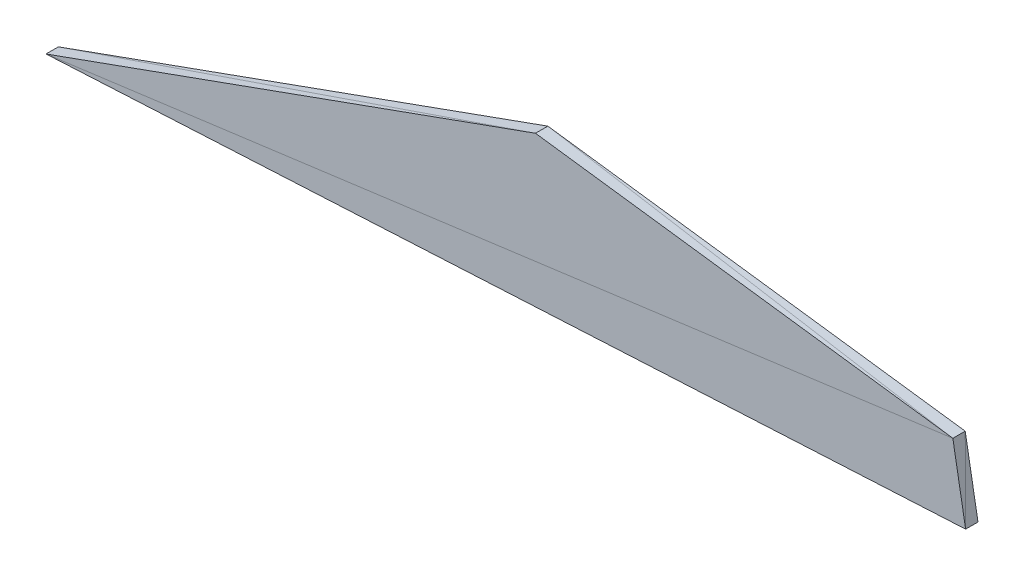
ISO-10303-21;
HEADER;
FILE_DESCRIPTION(('STEP AP214'),'2;1');
FILE_NAME('part.step','',(''),(''),'','','');
FILE_SCHEMA(('AUTOMOTIVE_DESIGN { 1 0 10303 214 1 1 1 1 }'));
ENDSEC;
DATA;
#1=APPLICATION_CONTEXT('core data for automotive mechanical design processes');
#2=APPLICATION_PROTOCOL_DEFINITION('international standard','automotive_design',2000,#1);
#3=PRODUCT_CONTEXT('',#1,'mechanical');
#4=PRODUCT('Part','Part','',(#3));
#5=PRODUCT_RELATED_PRODUCT_CATEGORY('part','',(#4));
#6=PRODUCT_DEFINITION_FORMATION('','',#4);
#7=PRODUCT_DEFINITION_CONTEXT('part definition',#1,'design');
#8=PRODUCT_DEFINITION('design','',#6,#7);
#9=PRODUCT_DEFINITION_SHAPE('','',#8);
#10=(LENGTH_UNIT() NAMED_UNIT(*) SI_UNIT(.MILLI.,.METRE.));
#11=(NAMED_UNIT(*) PLANE_ANGLE_UNIT() SI_UNIT($,.RADIAN.));
#12=(NAMED_UNIT(*) SI_UNIT($,.STERADIAN.) SOLID_ANGLE_UNIT());
#13=UNCERTAINTY_MEASURE_WITH_UNIT(LENGTH_MEASURE(1.E-05),#10,'distance_accuracy_value','');
#14=(GEOMETRIC_REPRESENTATION_CONTEXT(3) GLOBAL_UNCERTAINTY_ASSIGNED_CONTEXT((#13)) GLOBAL_UNIT_ASSIGNED_CONTEXT((#10,
#11,#12)) REPRESENTATION_CONTEXT('',''));
#15=CARTESIAN_POINT('',(0.,0.,0.));
#16=DIRECTION('',(0.,0.,1.));
#17=DIRECTION('',(1.,0.,0.));
#18=AXIS2_PLACEMENT_3D('',#15,#16,#17);
#19=CARTESIAN_POINT('',(-1.68216268592286E-07,1.26486290978761E-06,1.20013014997262));
#20=DIRECTION('',(-1.40165021765371E-07,1.05393811647491E-06,0.999999999999435));
#21=DIRECTION('',(0.,-0.999999999999445,1.05393811647492E-06));
#22=AXIS2_PLACEMENT_3D('',#19,#20,#21);
#23=PLANE('',#22);
#24=DIRECTION('',(0.174115513341141,-0.984725234780151,1.06224436390725E-06));
#25=VECTOR('',#24,1.);
#26=CARTESIAN_POINT('',(149.287655949593,138.98129761219,1.20000459719449));
#27=LINE('',#26,#25);
#28=CARTESIAN_POINT('',(149.287655949593,138.98129761219,1.20000459719449));
#29=VERTEX_POINT('',#28);
#30=CARTESIAN_POINT('',(150.527983903885,131.966516375542,1.20001216419041));
#31=VERTEX_POINT('',#30);
#32=EDGE_CURVE('E57',#29,#31,#27,.T.);
#33=ORIENTED_EDGE('',*,*,#32,.F.);
#34=DIRECTION('',(0.991272209683116,0.131830976291433,0.));
#35=VECTOR('',#34,1.);
#36=CARTESIAN_POINT('',(61.3317042589188,127.28388607502,1.20000459719449));
#37=LINE('',#36,#35);
#38=CARTESIAN_POINT('',(61.3317042589188,127.28388607502,1.20000459719449));
#39=VERTEX_POINT('',#38);
#40=EDGE_CURVE('E19',#39,#29,#37,.T.);
#41=ORIENTED_EDGE('',*,*,#40,.F.);
#42=DIRECTION('',(-0.998624819529042,-0.0524258506901051,-8.47186672338518E-08));
#43=VECTOR('',#42,1.);
#44=CARTESIAN_POINT('',(150.527983903885,131.966516375542,1.20001216419041));
#45=LINE('',#44,#43);
#46=EDGE_CURVE('E55',#31,#39,#45,.T.);
#47=ORIENTED_EDGE('',*,*,#46,.F.);
#48=EDGE_LOOP('',(#33,#41,#47));
#49=FACE_BOUND('',#48,.T.);
#50=ADVANCED_FACE('F16',(#49),#23,.T.);
#51=CARTESIAN_POINT('',(0.,0.,1.20000459719449));
#52=DIRECTION('',(0.,0.,1.));
#53=DIRECTION('',(1.,0.,0.));
#54=AXIS2_PLACEMENT_3D('',#51,#52,#53);
#55=PLANE('',#54);
#56=DIRECTION('',(0.991279953299742,-0.131772736884618,0.));
#57=VECTOR('',#56,1.);
#58=CARTESIAN_POINT('',(108.80871117115,144.362241029739,1.20000459719449));
#59=LINE('',#58,#57);
#60=CARTESIAN_POINT('',(108.80871117115,144.362241029739,1.20000459719449));
#61=VERTEX_POINT('',#60);
#62=EDGE_CURVE('E62',#61,#29,#59,.T.);
#63=ORIENTED_EDGE('',*,*,#62,.F.);
#64=DIRECTION('',(0.94097181761265,0.338484916146563,0.));
#65=VECTOR('',#64,1.);
#66=CARTESIAN_POINT('',(61.3317042589188,127.28388607502,1.20000459719449));
#67=LINE('',#66,#65);
#68=EDGE_CURVE('E66',#39,#61,#67,.T.);
#69=ORIENTED_EDGE('',*,*,#68,.F.);
#70=ORIENTED_EDGE('',*,*,#40,.T.);
#71=EDGE_LOOP('',(#63,#69,#70));
#72=FACE_BOUND('',#71,.T.);
#73=ADVANCED_FACE('F64',(#72),#55,.T.);
#74=CARTESIAN_POINT('',(168.590988715236,29.8096418250086,0.));
#75=DIRECTION('',(-0.984725234780706,-0.174115513341239,0.));
#76=DIRECTION('',(0.174115513341239,-0.984725234780706,0.));
#77=AXIS2_PLACEMENT_3D('',#74,#75,#76);
#78=PLANE('',#77);
#79=ORIENTED_EDGE('',*,*,#32,.T.);
#80=DIRECTION('',(0.171696433506692,-0.97104392108088,0.166114532937224));
#81=VECTOR('',#80,1.);
#82=CARTESIAN_POINT('',(149.287655949593,138.98129761219,7.6293948936268E-06));
#83=LINE('',#82,#81);
#84=CARTESIAN_POINT('',(149.287655949593,138.98129761219,7.6293948936268E-06));
#85=VERTEX_POINT('',#84);
#86=EDGE_CURVE('E70',#85,#31,#83,.T.);
#87=ORIENTED_EDGE('',*,*,#86,.F.);
#88=DIRECTION('',(0.,0.,-1.));
#89=VECTOR('',#88,1.);
#90=CARTESIAN_POINT('',(149.287655949593,138.98129761219,1.20000459719449));
#91=LINE('',#90,#89);
#92=EDGE_CURVE('E68',#29,#85,#91,.T.);
#93=ORIENTED_EDGE('',*,*,#92,.F.);
#94=EDGE_LOOP('',(#79,#87,#93));
#95=FACE_BOUND('',#94,.T.);
#96=ADVANCED_FACE('F69',(#95),#78,.F.);
#97=CARTESIAN_POINT('',(0.,0.,7.6293948936268E-06));
#98=DIRECTION('',(0.,0.,-1.));
#99=DIRECTION('',(-1.,0.,0.));
#100=AXIS2_PLACEMENT_3D('',#97,#98,#99);
#101=PLANE('',#100);
#102=DIRECTION('',(-0.94097181761265,-0.338484916146563,0.));
#103=VECTOR('',#102,1.);
#104=CARTESIAN_POINT('',(108.80871117115,144.362241029739,7.6293948936268E-06));
#105=LINE('',#104,#103);
#106=CARTESIAN_POINT('',(108.80871117115,144.362241029739,7.62939489359969E-06));
#107=VERTEX_POINT('',#106);
#108=CARTESIAN_POINT('',(61.3317042589188,127.28388607502,7.6293948936268E-06));
#109=VERTEX_POINT('',#108);
#110=EDGE_CURVE('E25',#107,#109,#105,.T.);
#111=ORIENTED_EDGE('',*,*,#110,.F.);
#112=DIRECTION('',(-0.991279953299742,0.131772736884618,0.));
#113=VECTOR('',#112,1.);
#114=CARTESIAN_POINT('',(149.287655949593,138.98129761219,7.6293948936268E-06));
#115=LINE('',#114,#113);
#116=EDGE_CURVE('E75',#85,#107,#115,.T.);
#117=ORIENTED_EDGE('',*,*,#116,.F.);
#118=DIRECTION('',(0.991272209683116,0.131830976291433,0.));
#119=VECTOR('',#118,1.);
#120=CARTESIAN_POINT('',(61.3317042589188,127.28388607502,7.6293948936268E-06));
#121=LINE('',#120,#119);
#122=EDGE_CURVE('E90',#109,#85,#121,.T.);
#123=ORIENTED_EDGE('',*,*,#122,.F.);
#124=EDGE_LOOP('',(#111,#117,#123));
#125=FACE_BOUND('',#124,.T.);
#126=ADVANCED_FACE('F112',(#125),#101,.T.);
#127=CARTESIAN_POINT('',(20.7464864452971,156.068520703454,0.));
#128=DIRECTION('',(-0.131772736884618,-0.991279953299742,0.));
#129=DIRECTION('',(0.991279953299742,-0.131772736884618,0.));
#130=AXIS2_PLACEMENT_3D('',#127,#128,#129);
#131=PLANE('',#130);
#132=ORIENTED_EDGE('',*,*,#62,.T.);
#133=DIRECTION('',(0.990852213425534,-0.131715876606438,0.029373780817562));
#134=VECTOR('',#133,1.);
#135=CARTESIAN_POINT('',(108.80871117115,144.362241029739,7.6293948936268E-06));
#136=LINE('',#135,#134);
#137=EDGE_CURVE('E78',#107,#29,#136,.T.);
#138=ORIENTED_EDGE('',*,*,#137,.F.);
#139=DIRECTION('',(0.,0.,-1.));
#140=VECTOR('',#139,1.);
#141=CARTESIAN_POINT('',(108.80871117115,144.362241029739,1.20000459719449));
#142=LINE('',#141,#140);
#143=EDGE_CURVE('E34',#61,#107,#142,.T.);
#144=ORIENTED_EDGE('',*,*,#143,.F.);
#145=EDGE_LOOP('',(#132,#138,#144));
#146=FACE_BOUND('',#145,.T.);
#147=ADVANCED_FACE('F77',(#146),#131,.F.);
#148=CARTESIAN_POINT('',(20.7464864452971,156.068520703454,0.));
#149=DIRECTION('',(0.131772736884618,0.991279953299742,0.));
#150=DIRECTION('',(-0.991279953299742,0.131772736884618,0.));
#151=AXIS2_PLACEMENT_3D('',#148,#149,#150);
#152=PLANE('',#151);
#153=ORIENTED_EDGE('',*,*,#92,.T.);
#154=ORIENTED_EDGE('',*,*,#116,.T.);
#155=ORIENTED_EDGE('',*,*,#137,.T.);
#156=EDGE_LOOP('',(#153,#154,#155));
#157=FACE_BOUND('',#156,.T.);
#158=ADVANCED_FACE('F80',(#157),#152,.T.);
#159=CARTESIAN_POINT('',(168.590988715236,29.8096418250086,0.));
#160=DIRECTION('',(0.984725234780706,0.174115513341239,0.));
#161=DIRECTION('',(-0.174115513341239,0.984725234780706,0.));
#162=AXIS2_PLACEMENT_3D('',#159,#160,#161);
#163=PLANE('',#162);
#164=DIRECTION('',(0.,0.,1.));
#165=VECTOR('',#164,1.);
#166=CARTESIAN_POINT('',(150.527983903885,131.966516375542,0.));
#167=LINE('',#166,#165);
#168=CARTESIAN_POINT('',(150.527983903885,131.966516375542,0.));
#169=VERTEX_POINT('',#168);
#170=EDGE_CURVE('E82',#169,#31,#167,.T.);
#171=ORIENTED_EDGE('',*,*,#170,.F.);
#172=DIRECTION('',(0.174115513341139,-0.984725234780141,-1.07100384522418E-06));
#173=VECTOR('',#172,1.);
#174=CARTESIAN_POINT('',(149.287655949593,138.98129761219,7.6293948936268E-06));
#175=LINE('',#174,#173);
#176=EDGE_CURVE('E89',#85,#169,#175,.T.);
#177=ORIENTED_EDGE('',*,*,#176,.F.);
#178=ORIENTED_EDGE('',*,*,#86,.T.);
#179=EDGE_LOOP('',(#171,#177,#178));
#180=FACE_BOUND('',#179,.T.);
#181=ADVANCED_FACE('F138',(#180),#163,.T.);
#182=CARTESIAN_POINT('',(-6.49522113588926,123.723105095038,0.));
#183=DIRECTION('',(-0.0524258506901053,0.998624819529046,0.));
#184=DIRECTION('',(-0.998624819529046,-0.0524258506901053,0.));
#185=AXIS2_PLACEMENT_3D('',#182,#183,#184);
#186=PLANE('',#185);
#187=ORIENTED_EDGE('',*,*,#46,.T.);
#188=DIRECTION('',(-0.998534705870427,-0.0524211198992022,0.0134338140813969));
#189=VECTOR('',#188,1.);
#190=CARTESIAN_POINT('',(150.527983903885,131.966516375542,0.));
#191=LINE('',#190,#189);
#192=EDGE_CURVE('E93',#169,#39,#191,.T.);
#193=ORIENTED_EDGE('',*,*,#192,.F.);
#194=ORIENTED_EDGE('',*,*,#170,.T.);
#195=EDGE_LOOP('',(#187,#193,#194));
#196=FACE_BOUND('',#195,.T.);
#197=ADVANCED_FACE('F135',(#196),#186,.F.);
#198=CARTESIAN_POINT('',(-1.68113472588819E-11,1.26408995926893E-10,-0.000118958718139522));
#199=DIRECTION('',(1.41320850811077E-07,-1.06262910279985E-06,0.999999999999425));
#200=DIRECTION('',(0.,-0.999999999999435,-1.06262910279986E-06));
#201=AXIS2_PLACEMENT_3D('',#198,#199,#200);
#202=PLANE('',#201);
#203=DIRECTION('',(0.998624819529042,0.0524258506901051,-8.54172744546059E-08));
#204=VECTOR('',#203,1.);
#205=CARTESIAN_POINT('',(61.3317042589188,127.28388607502,7.6293948936268E-06));
#206=LINE('',#205,#204);
#207=EDGE_CURVE('E96',#109,#169,#206,.T.);
#208=ORIENTED_EDGE('',*,*,#207,.F.);
#209=ORIENTED_EDGE('',*,*,#122,.T.);
#210=ORIENTED_EDGE('',*,*,#176,.T.);
#211=EDGE_LOOP('',(#208,#209,#210));
#212=FACE_BOUND('',#211,.T.);
#213=ADVANCED_FACE('F117',(#212),#202,.F.);
#214=CARTESIAN_POINT('',(-6.49522113588926,123.723105095038,0.));
#215=DIRECTION('',(0.0524258506901053,-0.998624819529046,0.));
#216=DIRECTION('',(0.998624819529046,0.0524258506901053,0.));
#217=AXIS2_PLACEMENT_3D('',#214,#215,#216);
#218=PLANE('',#217);
#219=DIRECTION('',(0.,0.,1.));
#220=VECTOR('',#219,1.);
#221=CARTESIAN_POINT('',(61.3317042589188,127.28388607502,7.6293948936268E-06));
#222=LINE('',#221,#220);
#223=EDGE_CURVE('E99',#109,#39,#222,.T.);
#224=ORIENTED_EDGE('',*,*,#223,.F.);
#225=ORIENTED_EDGE('',*,*,#207,.T.);
#226=ORIENTED_EDGE('',*,*,#192,.T.);
#227=EDGE_LOOP('',(#224,#225,#226));
#228=FACE_BOUND('',#227,.T.);
#229=ADVANCED_FACE('F119',(#228),#218,.T.);
#230=CARTESIAN_POINT('',(-33.5136260701972,93.1662716231922,0.));
#231=DIRECTION('',(0.338484916146563,-0.94097181761265,0.));
#232=DIRECTION('',(0.94097181761265,0.338484916146563,0.));
#233=AXIS2_PLACEMENT_3D('',#230,#231,#232);
#234=PLANE('',#233);
#235=ORIENTED_EDGE('',*,*,#68,.T.);
#236=DIRECTION('',(0.94070580067417,0.338389224947922,0.0237766485677444));
#237=VECTOR('',#236,1.);
#238=CARTESIAN_POINT('',(61.3317042589188,127.28388607502,7.6293948936268E-06));
#239=LINE('',#238,#237);
#240=EDGE_CURVE('E10',#109,#61,#239,.T.);
#241=ORIENTED_EDGE('',*,*,#240,.F.);
#242=ORIENTED_EDGE('',*,*,#223,.T.);
#243=EDGE_LOOP('',(#235,#241,#242));
#244=FACE_BOUND('',#243,.T.);
#245=ADVANCED_FACE('F122',(#244),#234,.F.);
#246=CARTESIAN_POINT('',(-33.5136260701972,93.1662716231922,0.));
#247=DIRECTION('',(-0.338484916146563,0.94097181761265,0.));
#248=DIRECTION('',(-0.94097181761265,-0.338484916146563,0.));
#249=AXIS2_PLACEMENT_3D('',#246,#247,#248);
#250=PLANE('',#249);
#251=ORIENTED_EDGE('',*,*,#143,.T.);
#252=ORIENTED_EDGE('',*,*,#110,.T.);
#253=ORIENTED_EDGE('',*,*,#240,.T.);
#254=EDGE_LOOP('',(#251,#252,#253));
#255=FACE_BOUND('',#254,.T.);
#256=ADVANCED_FACE('F109',(#255),#250,.T.);
#257=CLOSED_SHELL('',(#50,#73,#96,#126,#147,#158,#181,#197,#213,#229,#245,#256));
#258=MANIFOLD_SOLID_BREP('B1',#257);
#259=ADVANCED_BREP_SHAPE_REPRESENTATION('',(#18,#258),#14);
#260=SHAPE_DEFINITION_REPRESENTATION(#9,#259);
ENDSEC;
END-ISO-10303-21;
